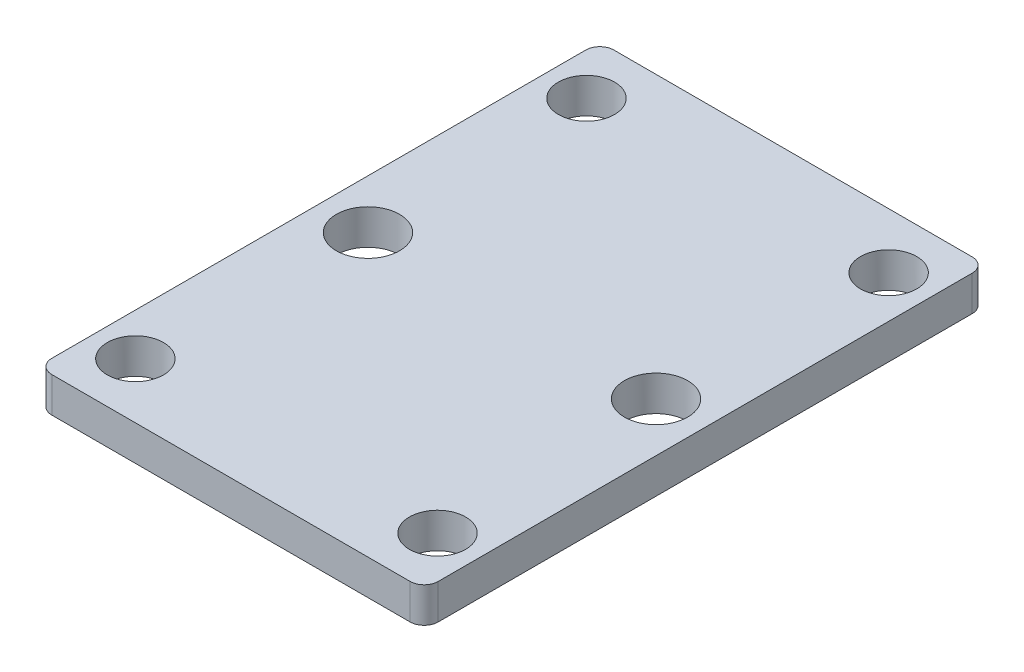
ISO-10303-21;
HEADER;
FILE_DESCRIPTION(('STEP AP214'),'2;1');
FILE_NAME('part.step','',(''),(''),'','','');
FILE_SCHEMA(('AUTOMOTIVE_DESIGN { 1 0 10303 214 1 1 1 1 }'));
ENDSEC;
DATA;
#1=APPLICATION_CONTEXT('core data for automotive mechanical design processes');
#2=APPLICATION_PROTOCOL_DEFINITION('international standard','automotive_design',2000,#1);
#3=PRODUCT_CONTEXT('',#1,'mechanical');
#4=PRODUCT('Part','Part','',(#3));
#5=PRODUCT_RELATED_PRODUCT_CATEGORY('part','',(#4));
#6=PRODUCT_DEFINITION_FORMATION('','',#4);
#7=PRODUCT_DEFINITION_CONTEXT('part definition',#1,'design');
#8=PRODUCT_DEFINITION('design','',#6,#7);
#9=PRODUCT_DEFINITION_SHAPE('','',#8);
#10=(LENGTH_UNIT() NAMED_UNIT(*) SI_UNIT(.MILLI.,.METRE.));
#11=(NAMED_UNIT(*) PLANE_ANGLE_UNIT() SI_UNIT($,.RADIAN.));
#12=(NAMED_UNIT(*) SI_UNIT($,.STERADIAN.) SOLID_ANGLE_UNIT());
#13=UNCERTAINTY_MEASURE_WITH_UNIT(LENGTH_MEASURE(1.E-05),#10,'distance_accuracy_value','');
#14=(GEOMETRIC_REPRESENTATION_CONTEXT(3) GLOBAL_UNCERTAINTY_ASSIGNED_CONTEXT((#13)) GLOBAL_UNIT_ASSIGNED_CONTEXT((#10,
#11,#12)) REPRESENTATION_CONTEXT('',''));
#15=CARTESIAN_POINT('',(0.,0.,0.));
#16=DIRECTION('',(0.,0.,1.));
#17=DIRECTION('',(1.,0.,0.));
#18=AXIS2_PLACEMENT_3D('',#15,#16,#17);
#19=CARTESIAN_POINT('',(25.5,5.,38.));
#20=DIRECTION('',(0.,-1.,0.));
#21=DIRECTION('',(0.,0.,-1.));
#22=AXIS2_PLACEMENT_3D('',#19,#20,#21);
#23=CYLINDRICAL_SURFACE('',#22,2.);
#24=CARTESIAN_POINT('',(25.5,0.,38.));
#25=DIRECTION('',(0.,1.,0.));
#26=DIRECTION('',(0.,0.,1.));
#27=AXIS2_PLACEMENT_3D('',#24,#25,#26);
#28=CIRCLE('',#27,2.);
#29=CARTESIAN_POINT('',(25.5,0.,40.));
#30=VERTEX_POINT('',#29);
#31=CARTESIAN_POINT('',(27.5,0.,38.));
#32=VERTEX_POINT('',#31);
#33=EDGE_CURVE('E130',#30,#32,#28,.T.);
#34=ORIENTED_EDGE('',*,*,#33,.T.);
#35=DIRECTION('',(0.,-1.,0.));
#36=VECTOR('',#35,1.);
#37=CARTESIAN_POINT('',(27.5,5.,38.));
#38=LINE('',#37,#36);
#39=CARTESIAN_POINT('',(27.5,5.,38.));
#40=VERTEX_POINT('',#39);
#41=EDGE_CURVE('E11',#40,#32,#38,.T.);
#42=ORIENTED_EDGE('',*,*,#41,.F.);
#43=CARTESIAN_POINT('',(25.5,5.,38.));
#44=DIRECTION('',(0.,1.,0.));
#45=DIRECTION('',(0.,0.,1.));
#46=AXIS2_PLACEMENT_3D('',#43,#44,#45);
#47=CIRCLE('',#46,2.);
#48=CARTESIAN_POINT('',(25.5,5.,40.));
#49=VERTEX_POINT('',#48);
#50=EDGE_CURVE('E144',#49,#40,#47,.T.);
#51=ORIENTED_EDGE('',*,*,#50,.F.);
#52=DIRECTION('',(0.,-1.,0.));
#53=VECTOR('',#52,1.);
#54=CARTESIAN_POINT('',(25.5,5.,40.));
#55=LINE('',#54,#53);
#56=EDGE_CURVE('E126',#49,#30,#55,.T.);
#57=ORIENTED_EDGE('',*,*,#56,.T.);
#58=EDGE_LOOP('',(#34,#42,#51,#57));
#59=FACE_BOUND('',#58,.T.);
#60=ADVANCED_FACE('F32',(#59),#23,.T.);
#61=CARTESIAN_POINT('',(27.5,5.,-38.));
#62=DIRECTION('',(-1.,0.,0.));
#63=DIRECTION('',(0.,0.,1.));
#64=AXIS2_PLACEMENT_3D('',#61,#62,#63);
#65=PLANE('',#64);
#66=DIRECTION('',(0.,0.,-1.));
#67=VECTOR('',#66,1.);
#68=CARTESIAN_POINT('',(27.5,0.,-38.));
#69=LINE('',#68,#67);
#70=CARTESIAN_POINT('',(27.5,0.,-38.));
#71=VERTEX_POINT('',#70);
#72=EDGE_CURVE('E133',#32,#71,#69,.T.);
#73=ORIENTED_EDGE('',*,*,#72,.T.);
#74=DIRECTION('',(0.,-1.,0.));
#75=VECTOR('',#74,1.);
#76=CARTESIAN_POINT('',(27.5,5.,-38.));
#77=LINE('',#76,#75);
#78=CARTESIAN_POINT('',(27.5,5.,-38.));
#79=VERTEX_POINT('',#78);
#80=EDGE_CURVE('E41',#79,#71,#77,.T.);
#81=ORIENTED_EDGE('',*,*,#80,.F.);
#82=DIRECTION('',(0.,0.,-1.));
#83=VECTOR('',#82,1.);
#84=CARTESIAN_POINT('',(27.5,5.,-38.));
#85=LINE('',#84,#83);
#86=EDGE_CURVE('E93',#40,#79,#85,.T.);
#87=ORIENTED_EDGE('',*,*,#86,.F.);
#88=ORIENTED_EDGE('',*,*,#41,.T.);
#89=EDGE_LOOP('',(#73,#81,#87,#88));
#90=FACE_BOUND('',#89,.T.);
#91=ADVANCED_FACE('F191',(#90),#65,.F.);
#92=CARTESIAN_POINT('',(25.5,5.,-38.));
#93=DIRECTION('',(0.,-1.,0.));
#94=DIRECTION('',(0.,0.,-1.));
#95=AXIS2_PLACEMENT_3D('',#92,#93,#94);
#96=CYLINDRICAL_SURFACE('',#95,2.);
#97=CARTESIAN_POINT('',(25.5,0.,-38.));
#98=DIRECTION('',(0.,1.,0.));
#99=DIRECTION('',(0.,0.,-1.));
#100=AXIS2_PLACEMENT_3D('',#97,#98,#99);
#101=CIRCLE('',#100,2.);
#102=CARTESIAN_POINT('',(25.5,0.,-40.));
#103=VERTEX_POINT('',#102);
#104=EDGE_CURVE('E135',#71,#103,#101,.T.);
#105=ORIENTED_EDGE('',*,*,#104,.T.);
#106=DIRECTION('',(0.,-1.,0.));
#107=VECTOR('',#106,1.);
#108=CARTESIAN_POINT('',(25.5,5.,-40.));
#109=LINE('',#108,#107);
#110=CARTESIAN_POINT('',(25.5,5.,-40.));
#111=VERTEX_POINT('',#110);
#112=EDGE_CURVE('E151',#111,#103,#109,.T.);
#113=ORIENTED_EDGE('',*,*,#112,.F.);
#114=CARTESIAN_POINT('',(25.5,5.,-38.));
#115=DIRECTION('',(0.,1.,0.));
#116=DIRECTION('',(0.,0.,-1.));
#117=AXIS2_PLACEMENT_3D('',#114,#115,#116);
#118=CIRCLE('',#117,2.);
#119=EDGE_CURVE('E206',#79,#111,#118,.T.);
#120=ORIENTED_EDGE('',*,*,#119,.F.);
#121=ORIENTED_EDGE('',*,*,#80,.T.);
#122=EDGE_LOOP('',(#105,#113,#120,#121));
#123=FACE_BOUND('',#122,.T.);
#124=ADVANCED_FACE('F196',(#123),#96,.T.);
#125=CARTESIAN_POINT('',(-25.5,5.,-40.));
#126=DIRECTION('',(0.,0.,1.));
#127=DIRECTION('',(1.,0.,0.));
#128=AXIS2_PLACEMENT_3D('',#125,#126,#127);
#129=PLANE('',#128);
#130=DIRECTION('',(-1.,0.,0.));
#131=VECTOR('',#130,1.);
#132=CARTESIAN_POINT('',(-25.5,0.,-40.));
#133=LINE('',#132,#131);
#134=CARTESIAN_POINT('',(-25.5,0.,-40.));
#135=VERTEX_POINT('',#134);
#136=EDGE_CURVE('E137',#103,#135,#133,.T.);
#137=ORIENTED_EDGE('',*,*,#136,.T.);
#138=DIRECTION('',(0.,-1.,0.));
#139=VECTOR('',#138,1.);
#140=CARTESIAN_POINT('',(-25.5,5.,-40.));
#141=LINE('',#140,#139);
#142=CARTESIAN_POINT('',(-25.5,5.,-40.));
#143=VERTEX_POINT('',#142);
#144=EDGE_CURVE('E148',#143,#135,#141,.T.);
#145=ORIENTED_EDGE('',*,*,#144,.F.);
#146=DIRECTION('',(-1.,0.,0.));
#147=VECTOR('',#146,1.);
#148=CARTESIAN_POINT('',(-25.5,5.,-40.));
#149=LINE('',#148,#147);
#150=EDGE_CURVE('E208',#111,#143,#149,.T.);
#151=ORIENTED_EDGE('',*,*,#150,.F.);
#152=ORIENTED_EDGE('',*,*,#112,.T.);
#153=EDGE_LOOP('',(#137,#145,#151,#152));
#154=FACE_BOUND('',#153,.T.);
#155=ADVANCED_FACE('F261',(#154),#129,.F.);
#156=CARTESIAN_POINT('',(-25.5,5.,-38.));
#157=DIRECTION('',(0.,-1.,0.));
#158=DIRECTION('',(0.,0.,-1.));
#159=AXIS2_PLACEMENT_3D('',#156,#157,#158);
#160=CYLINDRICAL_SURFACE('',#159,2.);
#161=CARTESIAN_POINT('',(-25.5,0.,-38.));
#162=DIRECTION('',(0.,1.,0.));
#163=DIRECTION('',(0.,0.,-1.));
#164=AXIS2_PLACEMENT_3D('',#161,#162,#163);
#165=CIRCLE('',#164,2.);
#166=CARTESIAN_POINT('',(-27.5,0.,-38.));
#167=VERTEX_POINT('',#166);
#168=EDGE_CURVE('E139',#135,#167,#165,.T.);
#169=ORIENTED_EDGE('',*,*,#168,.T.);
#170=DIRECTION('',(0.,-1.,0.));
#171=VECTOR('',#170,1.);
#172=CARTESIAN_POINT('',(-27.5,5.,-38.));
#173=LINE('',#172,#171);
#174=CARTESIAN_POINT('',(-27.5,5.,-38.));
#175=VERTEX_POINT('',#174);
#176=EDGE_CURVE('E121',#175,#167,#173,.T.);
#177=ORIENTED_EDGE('',*,*,#176,.F.);
#178=CARTESIAN_POINT('',(-25.5,5.,-38.));
#179=DIRECTION('',(0.,1.,0.));
#180=DIRECTION('',(0.,0.,-1.));
#181=AXIS2_PLACEMENT_3D('',#178,#179,#180);
#182=CIRCLE('',#181,2.);
#183=EDGE_CURVE('E112',#143,#175,#182,.T.);
#184=ORIENTED_EDGE('',*,*,#183,.F.);
#185=ORIENTED_EDGE('',*,*,#144,.T.);
#186=EDGE_LOOP('',(#169,#177,#184,#185));
#187=FACE_BOUND('',#186,.T.);
#188=ADVANCED_FACE('F258',(#187),#160,.T.);
#189=CARTESIAN_POINT('',(-27.5,5.,38.));
#190=DIRECTION('',(1.,0.,0.));
#191=DIRECTION('',(0.,0.,-1.));
#192=AXIS2_PLACEMENT_3D('',#189,#190,#191);
#193=PLANE('',#192);
#194=DIRECTION('',(0.,0.,1.));
#195=VECTOR('',#194,1.);
#196=CARTESIAN_POINT('',(-27.5,0.,38.));
#197=LINE('',#196,#195);
#198=CARTESIAN_POINT('',(-27.5,0.,38.));
#199=VERTEX_POINT('',#198);
#200=EDGE_CURVE('E120',#167,#199,#197,.T.);
#201=ORIENTED_EDGE('',*,*,#200,.T.);
#202=DIRECTION('',(0.,-1.,0.));
#203=VECTOR('',#202,1.);
#204=CARTESIAN_POINT('',(-27.5,5.,38.));
#205=LINE('',#204,#203);
#206=CARTESIAN_POINT('',(-27.5,5.,38.));
#207=VERTEX_POINT('',#206);
#208=EDGE_CURVE('E117',#207,#199,#205,.T.);
#209=ORIENTED_EDGE('',*,*,#208,.F.);
#210=DIRECTION('',(0.,0.,1.));
#211=VECTOR('',#210,1.);
#212=CARTESIAN_POINT('',(-27.5,5.,38.));
#213=LINE('',#212,#211);
#214=EDGE_CURVE('E106',#175,#207,#213,.T.);
#215=ORIENTED_EDGE('',*,*,#214,.F.);
#216=ORIENTED_EDGE('',*,*,#176,.T.);
#217=EDGE_LOOP('',(#201,#209,#215,#216));
#218=FACE_BOUND('',#217,.T.);
#219=ADVANCED_FACE('F118',(#218),#193,.F.);
#220=CARTESIAN_POINT('',(-25.5,5.,38.));
#221=DIRECTION('',(0.,-1.,0.));
#222=DIRECTION('',(0.,0.,-1.));
#223=AXIS2_PLACEMENT_3D('',#220,#221,#222);
#224=CYLINDRICAL_SURFACE('',#223,1.99999999999999);
#225=CARTESIAN_POINT('',(-25.5,0.,38.));
#226=DIRECTION('',(0.,1.,0.));
#227=DIRECTION('',(0.,0.,-1.));
#228=AXIS2_PLACEMENT_3D('',#225,#226,#227);
#229=CIRCLE('',#228,1.99999999999999);
#230=CARTESIAN_POINT('',(-25.5,0.,40.));
#231=VERTEX_POINT('',#230);
#232=EDGE_CURVE('E79',#199,#231,#229,.T.);
#233=ORIENTED_EDGE('',*,*,#232,.T.);
#234=DIRECTION('',(0.,-1.,0.));
#235=VECTOR('',#234,1.);
#236=CARTESIAN_POINT('',(-25.5,5.,40.));
#237=LINE('',#236,#235);
#238=CARTESIAN_POINT('',(-25.5,5.,40.));
#239=VERTEX_POINT('',#238);
#240=EDGE_CURVE('E122',#239,#231,#237,.T.);
#241=ORIENTED_EDGE('',*,*,#240,.F.);
#242=CARTESIAN_POINT('',(-25.5,5.,38.));
#243=DIRECTION('',(0.,1.,0.));
#244=DIRECTION('',(0.,0.,-1.));
#245=AXIS2_PLACEMENT_3D('',#242,#243,#244);
#246=CIRCLE('',#245,1.99999999999999);
#247=EDGE_CURVE('E110',#207,#239,#246,.T.);
#248=ORIENTED_EDGE('',*,*,#247,.F.);
#249=ORIENTED_EDGE('',*,*,#208,.T.);
#250=EDGE_LOOP('',(#233,#241,#248,#249));
#251=FACE_BOUND('',#250,.T.);
#252=ADVANCED_FACE('F124',(#251),#224,.T.);
#253=CARTESIAN_POINT('',(-25.5,5.,40.));
#254=DIRECTION('',(0.,0.,-1.));
#255=DIRECTION('',(-1.,0.,0.));
#256=AXIS2_PLACEMENT_3D('',#253,#254,#255);
#257=PLANE('',#256);
#258=DIRECTION('',(1.,0.,0.));
#259=VECTOR('',#258,1.);
#260=CARTESIAN_POINT('',(-25.5,0.,40.));
#261=LINE('',#260,#259);
#262=EDGE_CURVE('E85',#231,#30,#261,.T.);
#263=ORIENTED_EDGE('',*,*,#262,.T.);
#264=ORIENTED_EDGE('',*,*,#56,.F.);
#265=DIRECTION('',(1.,0.,0.));
#266=VECTOR('',#265,1.);
#267=CARTESIAN_POINT('',(-25.5,5.,40.));
#268=LINE('',#267,#266);
#269=EDGE_CURVE('E50',#239,#49,#268,.T.);
#270=ORIENTED_EDGE('',*,*,#269,.F.);
#271=ORIENTED_EDGE('',*,*,#240,.T.);
#272=EDGE_LOOP('',(#263,#264,#270,#271));
#273=FACE_BOUND('',#272,.T.);
#274=ADVANCED_FACE('F236',(#273),#257,.F.);
#275=CARTESIAN_POINT('',(25.5,5.,38.));
#276=DIRECTION('',(0.,1.,0.));
#277=DIRECTION('',(0.,0.,1.));
#278=AXIS2_PLACEMENT_3D('',#275,#276,#277);
#279=PLANE('',#278);
#280=CARTESIAN_POINT('',(21.5,5.,-32.1));
#281=DIRECTION('',(0.,1.,0.));
#282=DIRECTION('',(0.,0.,-1.));
#283=AXIS2_PLACEMENT_3D('',#280,#281,#282);
#284=CIRCLE('',#283,3.99999999999999);
#285=CARTESIAN_POINT('',(21.5,5.,-36.1));
#286=VERTEX_POINT('',#285);
#287=EDGE_CURVE('E223',#286,#286,#284,.T.);
#288=ORIENTED_EDGE('',*,*,#287,.F.);
#289=EDGE_LOOP('',(#288));
#290=FACE_BOUND('',#289,.T.);
#291=CARTESIAN_POINT('',(-21.5,5.,32.1));
#292=DIRECTION('',(0.,1.,0.));
#293=DIRECTION('',(0.,0.,-1.));
#294=AXIS2_PLACEMENT_3D('',#291,#292,#293);
#295=CIRCLE('',#294,3.99999999999999);
#296=CARTESIAN_POINT('',(-21.5,5.,28.1));
#297=VERTEX_POINT('',#296);
#298=EDGE_CURVE('E220',#297,#297,#295,.T.);
#299=ORIENTED_EDGE('',*,*,#298,.F.);
#300=EDGE_LOOP('',(#299));
#301=FACE_BOUND('',#300,.T.);
#302=CARTESIAN_POINT('',(-21.5,5.,-32.1));
#303=DIRECTION('',(0.,1.,0.));
#304=DIRECTION('',(0.,0.,1.));
#305=AXIS2_PLACEMENT_3D('',#302,#303,#304);
#306=CIRCLE('',#305,3.99999999999999);
#307=CARTESIAN_POINT('',(-21.5,5.,-28.1));
#308=VERTEX_POINT('',#307);
#309=EDGE_CURVE('E217',#308,#308,#306,.T.);
#310=ORIENTED_EDGE('',*,*,#309,.F.);
#311=EDGE_LOOP('',(#310));
#312=FACE_BOUND('',#311,.T.);
#313=CARTESIAN_POINT('',(20.5,5.,0.));
#314=DIRECTION('',(0.,1.,0.));
#315=DIRECTION('',(0.,0.,-1.));
#316=AXIS2_PLACEMENT_3D('',#313,#314,#315);
#317=CIRCLE('',#316,4.5);
#318=CARTESIAN_POINT('',(20.5,5.,-4.5));
#319=VERTEX_POINT('',#318);
#320=EDGE_CURVE('E216',#319,#319,#317,.T.);
#321=ORIENTED_EDGE('',*,*,#320,.F.);
#322=EDGE_LOOP('',(#321));
#323=FACE_BOUND('',#322,.T.);
#324=CARTESIAN_POINT('',(21.5,5.,32.1));
#325=DIRECTION('',(0.,1.,0.));
#326=DIRECTION('',(0.,0.,1.));
#327=AXIS2_PLACEMENT_3D('',#324,#325,#326);
#328=CIRCLE('',#327,3.99999999999999);
#329=CARTESIAN_POINT('',(21.5,5.,36.1));
#330=VERTEX_POINT('',#329);
#331=EDGE_CURVE('E225',#330,#330,#328,.T.);
#332=ORIENTED_EDGE('',*,*,#331,.F.);
#333=EDGE_LOOP('',(#332));
#334=FACE_BOUND('',#333,.T.);
#335=CARTESIAN_POINT('',(-20.5,5.,0.));
#336=DIRECTION('',(0.,1.,0.));
#337=DIRECTION('',(0.,0.,1.));
#338=AXIS2_PLACEMENT_3D('',#335,#336,#337);
#339=CIRCLE('',#338,4.5);
#340=CARTESIAN_POINT('',(-20.5,5.,4.5));
#341=VERTEX_POINT('',#340);
#342=EDGE_CURVE('E160',#341,#341,#339,.T.);
#343=ORIENTED_EDGE('',*,*,#342,.F.);
#344=EDGE_LOOP('',(#343));
#345=FACE_BOUND('',#344,.T.);
#346=ORIENTED_EDGE('',*,*,#50,.T.);
#347=ORIENTED_EDGE('',*,*,#86,.T.);
#348=ORIENTED_EDGE('',*,*,#119,.T.);
#349=ORIENTED_EDGE('',*,*,#150,.T.);
#350=ORIENTED_EDGE('',*,*,#183,.T.);
#351=ORIENTED_EDGE('',*,*,#214,.T.);
#352=ORIENTED_EDGE('',*,*,#247,.T.);
#353=ORIENTED_EDGE('',*,*,#269,.T.);
#354=EDGE_LOOP('',(#346,#347,#348,#349,#350,#351,#352,#353));
#355=FACE_BOUND('',#354,.T.);
#356=ADVANCED_FACE('F108',(#290,#301,#312,#323,#334,#345,#355),#279,.T.);
#357=CARTESIAN_POINT('',(25.5,0.,38.));
#358=DIRECTION('',(0.,1.,0.));
#359=DIRECTION('',(0.,0.,1.));
#360=AXIS2_PLACEMENT_3D('',#357,#358,#359);
#361=PLANE('',#360);
#362=CARTESIAN_POINT('',(21.5,0.,-32.1));
#363=DIRECTION('',(0.,1.,0.));
#364=DIRECTION('',(0.,0.,1.));
#365=AXIS2_PLACEMENT_3D('',#362,#363,#364);
#366=CIRCLE('',#365,3.99999999999999);
#367=CARTESIAN_POINT('',(21.5,0.,-28.1));
#368=VERTEX_POINT('',#367);
#369=EDGE_CURVE('E35',#368,#368,#366,.T.);
#370=ORIENTED_EDGE('',*,*,#369,.T.);
#371=EDGE_LOOP('',(#370));
#372=FACE_BOUND('',#371,.T.);
#373=CARTESIAN_POINT('',(-21.5,0.,32.1));
#374=DIRECTION('',(0.,1.,0.));
#375=DIRECTION('',(0.,0.,1.));
#376=AXIS2_PLACEMENT_3D('',#373,#374,#375);
#377=CIRCLE('',#376,3.99999999999999);
#378=CARTESIAN_POINT('',(-21.5,0.,36.1));
#379=VERTEX_POINT('',#378);
#380=EDGE_CURVE('E168',#379,#379,#377,.T.);
#381=ORIENTED_EDGE('',*,*,#380,.T.);
#382=EDGE_LOOP('',(#381));
#383=FACE_BOUND('',#382,.T.);
#384=CARTESIAN_POINT('',(-21.5,0.,-32.1));
#385=DIRECTION('',(0.,1.,0.));
#386=DIRECTION('',(0.,0.,1.));
#387=AXIS2_PLACEMENT_3D('',#384,#385,#386);
#388=CIRCLE('',#387,3.99999999999999);
#389=CARTESIAN_POINT('',(-21.5,0.,-28.1));
#390=VERTEX_POINT('',#389);
#391=EDGE_CURVE('E166',#390,#390,#388,.T.);
#392=ORIENTED_EDGE('',*,*,#391,.T.);
#393=EDGE_LOOP('',(#392));
#394=FACE_BOUND('',#393,.T.);
#395=CARTESIAN_POINT('',(20.5,0.,0.));
#396=DIRECTION('',(0.,1.,0.));
#397=DIRECTION('',(0.,0.,1.));
#398=AXIS2_PLACEMENT_3D('',#395,#396,#397);
#399=CIRCLE('',#398,4.5);
#400=CARTESIAN_POINT('',(20.5,0.,4.5));
#401=VERTEX_POINT('',#400);
#402=EDGE_CURVE('E163',#401,#401,#399,.T.);
#403=ORIENTED_EDGE('',*,*,#402,.T.);
#404=EDGE_LOOP('',(#403));
#405=FACE_BOUND('',#404,.T.);
#406=CARTESIAN_POINT('',(21.5,0.,32.1));
#407=DIRECTION('',(0.,1.,0.));
#408=DIRECTION('',(0.,0.,1.));
#409=AXIS2_PLACEMENT_3D('',#406,#407,#408);
#410=CIRCLE('',#409,3.99999999999999);
#411=CARTESIAN_POINT('',(21.5,0.,36.1));
#412=VERTEX_POINT('',#411);
#413=EDGE_CURVE('E159',#412,#412,#410,.T.);
#414=ORIENTED_EDGE('',*,*,#413,.T.);
#415=EDGE_LOOP('',(#414));
#416=FACE_BOUND('',#415,.T.);
#417=CARTESIAN_POINT('',(-20.5,0.,0.));
#418=DIRECTION('',(0.,1.,0.));
#419=DIRECTION('',(0.,0.,1.));
#420=AXIS2_PLACEMENT_3D('',#417,#418,#419);
#421=CIRCLE('',#420,4.5);
#422=CARTESIAN_POINT('',(-20.5,0.,4.5));
#423=VERTEX_POINT('',#422);
#424=EDGE_CURVE('E156',#423,#423,#421,.T.);
#425=ORIENTED_EDGE('',*,*,#424,.T.);
#426=EDGE_LOOP('',(#425));
#427=FACE_BOUND('',#426,.T.);
#428=ORIENTED_EDGE('',*,*,#33,.F.);
#429=ORIENTED_EDGE('',*,*,#262,.F.);
#430=ORIENTED_EDGE('',*,*,#232,.F.);
#431=ORIENTED_EDGE('',*,*,#200,.F.);
#432=ORIENTED_EDGE('',*,*,#168,.F.);
#433=ORIENTED_EDGE('',*,*,#136,.F.);
#434=ORIENTED_EDGE('',*,*,#104,.F.);
#435=ORIENTED_EDGE('',*,*,#72,.F.);
#436=EDGE_LOOP('',(#428,#429,#430,#431,#432,#433,#434,#435));
#437=FACE_BOUND('',#436,.T.);
#438=ADVANCED_FACE('F175',(#372,#383,#394,#405,#416,#427,#437),#361,.F.);
#439=CARTESIAN_POINT('',(-20.5,-5.,0.));
#440=DIRECTION('',(0.,1.,0.));
#441=DIRECTION('',(0.,0.,1.));
#442=AXIS2_PLACEMENT_3D('',#439,#440,#441);
#443=CYLINDRICAL_SURFACE('',#442,4.5);
#444=ORIENTED_EDGE('',*,*,#342,.T.);
#445=EDGE_LOOP('',(#444));
#446=FACE_BOUND('',#445,.T.);
#447=ORIENTED_EDGE('',*,*,#424,.F.);
#448=EDGE_LOOP('',(#447));
#449=FACE_BOUND('',#448,.T.);
#450=ADVANCED_FACE('F241',(#446,#449),#443,.F.);
#451=CARTESIAN_POINT('',(21.5,-5.,32.1));
#452=DIRECTION('',(0.,1.,0.));
#453=DIRECTION('',(0.,0.,1.));
#454=AXIS2_PLACEMENT_3D('',#451,#452,#453);
#455=CYLINDRICAL_SURFACE('',#454,3.99999999999999);
#456=ORIENTED_EDGE('',*,*,#331,.T.);
#457=EDGE_LOOP('',(#456));
#458=FACE_BOUND('',#457,.T.);
#459=ORIENTED_EDGE('',*,*,#413,.F.);
#460=EDGE_LOOP('',(#459));
#461=FACE_BOUND('',#460,.T.);
#462=ADVANCED_FACE('F231',(#458,#461),#455,.F.);
#463=CARTESIAN_POINT('',(20.5,-5.,0.));
#464=DIRECTION('',(0.,1.,0.));
#465=DIRECTION('',(0.,0.,1.));
#466=AXIS2_PLACEMENT_3D('',#463,#464,#465);
#467=CYLINDRICAL_SURFACE('',#466,4.5);
#468=ORIENTED_EDGE('',*,*,#320,.T.);
#469=EDGE_LOOP('',(#468));
#470=FACE_BOUND('',#469,.T.);
#471=ORIENTED_EDGE('',*,*,#402,.F.);
#472=EDGE_LOOP('',(#471));
#473=FACE_BOUND('',#472,.T.);
#474=ADVANCED_FACE('F314',(#470,#473),#467,.F.);
#475=CARTESIAN_POINT('',(-21.5,-5.,-32.1));
#476=DIRECTION('',(0.,1.,0.));
#477=DIRECTION('',(0.,0.,1.));
#478=AXIS2_PLACEMENT_3D('',#475,#476,#477);
#479=CYLINDRICAL_SURFACE('',#478,3.99999999999999);
#480=ORIENTED_EDGE('',*,*,#309,.T.);
#481=EDGE_LOOP('',(#480));
#482=FACE_BOUND('',#481,.T.);
#483=ORIENTED_EDGE('',*,*,#391,.F.);
#484=EDGE_LOOP('',(#483));
#485=FACE_BOUND('',#484,.T.);
#486=ADVANCED_FACE('F185',(#482,#485),#479,.F.);
#487=CARTESIAN_POINT('',(-21.5,-5.,32.1));
#488=DIRECTION('',(0.,1.,0.));
#489=DIRECTION('',(0.,0.,1.));
#490=AXIS2_PLACEMENT_3D('',#487,#488,#489);
#491=CYLINDRICAL_SURFACE('',#490,3.99999999999999);
#492=ORIENTED_EDGE('',*,*,#298,.T.);
#493=EDGE_LOOP('',(#492));
#494=FACE_BOUND('',#493,.T.);
#495=ORIENTED_EDGE('',*,*,#380,.F.);
#496=EDGE_LOOP('',(#495));
#497=FACE_BOUND('',#496,.T.);
#498=ADVANCED_FACE('F179',(#494,#497),#491,.F.);
#499=CARTESIAN_POINT('',(21.5,-5.,-32.1));
#500=DIRECTION('',(0.,1.,0.));
#501=DIRECTION('',(0.,0.,1.));
#502=AXIS2_PLACEMENT_3D('',#499,#500,#501);
#503=CYLINDRICAL_SURFACE('',#502,3.99999999999999);
#504=ORIENTED_EDGE('',*,*,#287,.T.);
#505=EDGE_LOOP('',(#504));
#506=FACE_BOUND('',#505,.T.);
#507=ORIENTED_EDGE('',*,*,#369,.F.);
#508=EDGE_LOOP('',(#507));
#509=FACE_BOUND('',#508,.T.);
#510=ADVANCED_FACE('F177',(#506,#509),#503,.F.);
#511=CLOSED_SHELL('',(#60,#91,#124,#155,#188,#219,#252,#274,#356,#438,#450,#462,#474,#486,#498,#510));
#512=MANIFOLD_SOLID_BREP('B2',#511);
#513=ADVANCED_BREP_SHAPE_REPRESENTATION('',(#18,#512),#14);
#514=SHAPE_DEFINITION_REPRESENTATION(#9,#513);
ENDSEC;
END-ISO-10303-21;
